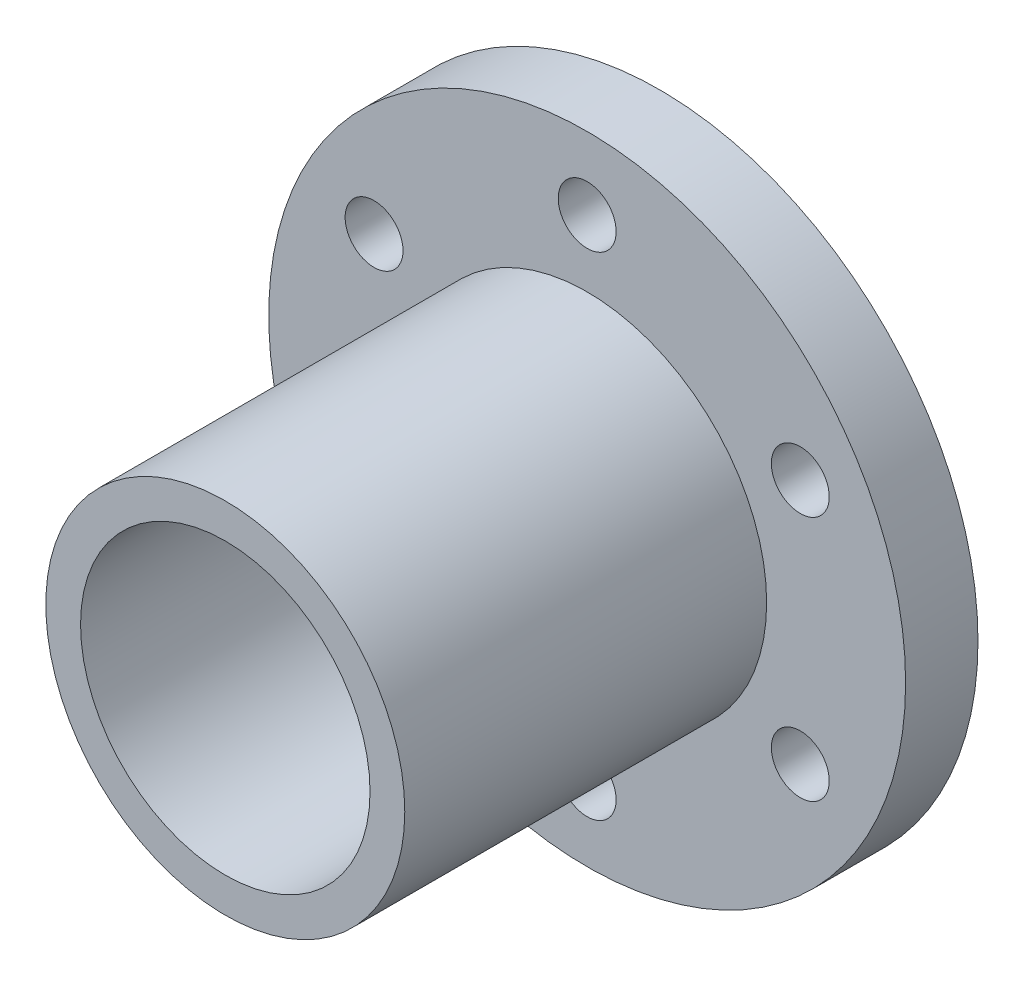
ISO-10303-21;
HEADER;
FILE_DESCRIPTION(('STEP AP214'),'2;1');
FILE_NAME('part.step','',(''),(''),'','','');
FILE_SCHEMA(('AUTOMOTIVE_DESIGN { 1 0 10303 214 1 1 1 1 }'));
ENDSEC;
DATA;
#1=APPLICATION_CONTEXT('core data for automotive mechanical design processes');
#2=APPLICATION_PROTOCOL_DEFINITION('international standard','automotive_design',2000,#1);
#3=PRODUCT_CONTEXT('',#1,'mechanical');
#4=PRODUCT('Part','Part','',(#3));
#5=PRODUCT_RELATED_PRODUCT_CATEGORY('part','',(#4));
#6=PRODUCT_DEFINITION_FORMATION('','',#4);
#7=PRODUCT_DEFINITION_CONTEXT('part definition',#1,'design');
#8=PRODUCT_DEFINITION('design','',#6,#7);
#9=PRODUCT_DEFINITION_SHAPE('','',#8);
#10=(LENGTH_UNIT() NAMED_UNIT(*) SI_UNIT(.MILLI.,.METRE.));
#11=(NAMED_UNIT(*) PLANE_ANGLE_UNIT() SI_UNIT($,.RADIAN.));
#12=(NAMED_UNIT(*) SI_UNIT($,.STERADIAN.) SOLID_ANGLE_UNIT());
#13=UNCERTAINTY_MEASURE_WITH_UNIT(LENGTH_MEASURE(1.E-05),#10,'distance_accuracy_value','');
#14=(GEOMETRIC_REPRESENTATION_CONTEXT(3) GLOBAL_UNCERTAINTY_ASSIGNED_CONTEXT((#13)) GLOBAL_UNIT_ASSIGNED_CONTEXT((#10,
#11,#12)) REPRESENTATION_CONTEXT('',''));
#15=CARTESIAN_POINT('',(0.,0.,0.));
#16=DIRECTION('',(0.,0.,1.));
#17=DIRECTION('',(1.,0.,0.));
#18=AXIS2_PLACEMENT_3D('',#15,#16,#17);
#19=CARTESIAN_POINT('',(0.,0.,25.));
#20=DIRECTION('',(0.,0.,-1.));
#21=DIRECTION('',(-1.,0.,0.));
#22=AXIS2_PLACEMENT_3D('',#19,#20,#21);
#23=CYLINDRICAL_SURFACE('',#22,110.);
#24=CARTESIAN_POINT('',(0.,0.,25.));
#25=DIRECTION('',(0.,0.,1.));
#26=DIRECTION('',(1.,0.,0.));
#27=AXIS2_PLACEMENT_3D('',#24,#25,#26);
#28=CIRCLE('',#27,110.);
#29=CARTESIAN_POINT('',(110.,0.,25.));
#30=VERTEX_POINT('',#29);
#31=EDGE_CURVE('E51',#30,#30,#28,.T.);
#32=ORIENTED_EDGE('',*,*,#31,.F.);
#33=EDGE_LOOP('',(#32));
#34=FACE_BOUND('',#33,.T.);
#35=CARTESIAN_POINT('',(0.,0.,0.));
#36=DIRECTION('',(0.,0.,1.));
#37=DIRECTION('',(1.,0.,0.));
#38=AXIS2_PLACEMENT_3D('',#35,#36,#37);
#39=CIRCLE('',#38,110.);
#40=CARTESIAN_POINT('',(110.,0.,0.));
#41=VERTEX_POINT('',#40);
#42=EDGE_CURVE('E46',#41,#41,#39,.T.);
#43=ORIENTED_EDGE('',*,*,#42,.T.);
#44=EDGE_LOOP('',(#43));
#45=FACE_BOUND('',#44,.T.);
#46=ADVANCED_FACE('F43',(#34,#45),#23,.T.);
#47=CARTESIAN_POINT('',(0.,0.,25.));
#48=DIRECTION('',(0.,0.,1.));
#49=DIRECTION('',(1.,0.,0.));
#50=AXIS2_PLACEMENT_3D('',#47,#48,#49);
#51=PLANE('',#50);
#52=CARTESIAN_POINT('',(0.,85.,25.));
#53=DIRECTION('',(0.,0.,1.));
#54=DIRECTION('',(1.,0.,0.));
#55=AXIS2_PLACEMENT_3D('',#52,#53,#54);
#56=CIRCLE('',#55,9.99999999999999);
#57=CARTESIAN_POINT('',(9.99999999999999,85.,25.));
#58=VERTEX_POINT('',#57);
#59=EDGE_CURVE('E104',#58,#58,#56,.T.);
#60=ORIENTED_EDGE('',*,*,#59,.F.);
#61=EDGE_LOOP('',(#60));
#62=FACE_BOUND('',#61,.T.);
#63=CARTESIAN_POINT('',(-73.6121593216773,42.5,25.));
#64=DIRECTION('',(0.,0.,1.));
#65=DIRECTION('',(1.,0.,0.));
#66=AXIS2_PLACEMENT_3D('',#63,#64,#65);
#67=CIRCLE('',#66,9.99999999999999);
#68=CARTESIAN_POINT('',(-63.6121593216773,42.5,25.));
#69=VERTEX_POINT('',#68);
#70=EDGE_CURVE('E76',#69,#69,#67,.T.);
#71=ORIENTED_EDGE('',*,*,#70,.F.);
#72=EDGE_LOOP('',(#71));
#73=FACE_BOUND('',#72,.T.);
#74=CARTESIAN_POINT('',(-73.6121593216773,-42.5,25.));
#75=DIRECTION('',(0.,0.,1.));
#76=DIRECTION('',(1.,0.,0.));
#77=AXIS2_PLACEMENT_3D('',#74,#75,#76);
#78=CIRCLE('',#77,9.99999999999999);
#79=CARTESIAN_POINT('',(-63.6121593216773,-42.5,25.));
#80=VERTEX_POINT('',#79);
#81=EDGE_CURVE('E75',#80,#80,#78,.T.);
#82=ORIENTED_EDGE('',*,*,#81,.F.);
#83=EDGE_LOOP('',(#82));
#84=FACE_BOUND('',#83,.T.);
#85=CARTESIAN_POINT('',(0.,-85.,25.));
#86=DIRECTION('',(0.,0.,1.));
#87=DIRECTION('',(1.,0.,0.));
#88=AXIS2_PLACEMENT_3D('',#85,#86,#87);
#89=CIRCLE('',#88,9.99999999999999);
#90=CARTESIAN_POINT('',(10.,-85.,25.));
#91=VERTEX_POINT('',#90);
#92=EDGE_CURVE('E84',#91,#91,#89,.T.);
#93=ORIENTED_EDGE('',*,*,#92,.F.);
#94=EDGE_LOOP('',(#93));
#95=FACE_BOUND('',#94,.T.);
#96=CARTESIAN_POINT('',(73.6121593216773,-42.5,25.));
#97=DIRECTION('',(0.,0.,1.));
#98=DIRECTION('',(1.,0.,0.));
#99=AXIS2_PLACEMENT_3D('',#96,#97,#98);
#100=CIRCLE('',#99,10.);
#101=CARTESIAN_POINT('',(83.6121593216773,-42.5,25.));
#102=VERTEX_POINT('',#101);
#103=EDGE_CURVE('E92',#102,#102,#100,.T.);
#104=ORIENTED_EDGE('',*,*,#103,.F.);
#105=EDGE_LOOP('',(#104));
#106=FACE_BOUND('',#105,.T.);
#107=CARTESIAN_POINT('',(73.6121593216773,42.5,25.));
#108=DIRECTION('',(0.,0.,1.));
#109=DIRECTION('',(1.,0.,0.));
#110=AXIS2_PLACEMENT_3D('',#107,#108,#109);
#111=CIRCLE('',#110,9.99999999999999);
#112=CARTESIAN_POINT('',(83.6121593216773,42.5,25.));
#113=VERTEX_POINT('',#112);
#114=EDGE_CURVE('E100',#113,#113,#111,.T.);
#115=ORIENTED_EDGE('',*,*,#114,.F.);
#116=EDGE_LOOP('',(#115));
#117=FACE_BOUND('',#116,.T.);
#118=CARTESIAN_POINT('',(0.,0.,25.));
#119=DIRECTION('',(0.,0.,1.));
#120=DIRECTION('',(1.,0.,0.));
#121=AXIS2_PLACEMENT_3D('',#118,#119,#120);
#122=CIRCLE('',#121,62.);
#123=CARTESIAN_POINT('',(62.,0.,25.));
#124=VERTEX_POINT('',#123);
#125=EDGE_CURVE('E10',#124,#124,#122,.T.);
#126=ORIENTED_EDGE('',*,*,#125,.F.);
#127=EDGE_LOOP('',(#126));
#128=FACE_BOUND('',#127,.T.);
#129=ORIENTED_EDGE('',*,*,#31,.T.);
#130=EDGE_LOOP('',(#129));
#131=FACE_BOUND('',#130,.T.);
#132=ADVANCED_FACE('F129',(#62,#73,#84,#95,#106,#117,#128,#131),#51,.T.);
#133=CARTESIAN_POINT('',(0.,0.,0.));
#134=DIRECTION('',(0.,0.,1.));
#135=DIRECTION('',(1.,0.,0.));
#136=AXIS2_PLACEMENT_3D('',#133,#134,#135);
#137=PLANE('',#136);
#138=CARTESIAN_POINT('',(0.,85.,0.));
#139=DIRECTION('',(0.,0.,1.));
#140=DIRECTION('',(1.,0.,0.));
#141=AXIS2_PLACEMENT_3D('',#138,#139,#140);
#142=CIRCLE('',#141,9.99999999999999);
#143=CARTESIAN_POINT('',(9.99999999999999,85.,0.));
#144=VERTEX_POINT('',#143);
#145=EDGE_CURVE('E67',#144,#144,#142,.T.);
#146=ORIENTED_EDGE('',*,*,#145,.T.);
#147=EDGE_LOOP('',(#146));
#148=FACE_BOUND('',#147,.T.);
#149=CARTESIAN_POINT('',(-73.6121593216773,42.5,0.));
#150=DIRECTION('',(0.,0.,1.));
#151=DIRECTION('',(1.,0.,0.));
#152=AXIS2_PLACEMENT_3D('',#149,#150,#151);
#153=CIRCLE('',#152,9.99999999999999);
#154=CARTESIAN_POINT('',(-63.6121593216773,42.5,0.));
#155=VERTEX_POINT('',#154);
#156=EDGE_CURVE('E105',#155,#155,#153,.T.);
#157=ORIENTED_EDGE('',*,*,#156,.T.);
#158=EDGE_LOOP('',(#157));
#159=FACE_BOUND('',#158,.T.);
#160=CARTESIAN_POINT('',(-73.6121593216773,-42.5,0.));
#161=DIRECTION('',(0.,0.,1.));
#162=DIRECTION('',(1.,0.,0.));
#163=AXIS2_PLACEMENT_3D('',#160,#161,#162);
#164=CIRCLE('',#163,9.99999999999999);
#165=CARTESIAN_POINT('',(-63.6121593216773,-42.5,0.));
#166=VERTEX_POINT('',#165);
#167=EDGE_CURVE('E71',#166,#166,#164,.T.);
#168=ORIENTED_EDGE('',*,*,#167,.T.);
#169=EDGE_LOOP('',(#168));
#170=FACE_BOUND('',#169,.T.);
#171=CARTESIAN_POINT('',(0.,-85.,0.));
#172=DIRECTION('',(0.,0.,1.));
#173=DIRECTION('',(1.,0.,0.));
#174=AXIS2_PLACEMENT_3D('',#171,#172,#173);
#175=CIRCLE('',#174,9.99999999999999);
#176=CARTESIAN_POINT('',(10.,-85.,0.));
#177=VERTEX_POINT('',#176);
#178=EDGE_CURVE('E80',#177,#177,#175,.T.);
#179=ORIENTED_EDGE('',*,*,#178,.T.);
#180=EDGE_LOOP('',(#179));
#181=FACE_BOUND('',#180,.T.);
#182=CARTESIAN_POINT('',(73.6121593216773,-42.5,0.));
#183=DIRECTION('',(0.,0.,1.));
#184=DIRECTION('',(1.,0.,0.));
#185=AXIS2_PLACEMENT_3D('',#182,#183,#184);
#186=CIRCLE('',#185,10.);
#187=CARTESIAN_POINT('',(83.6121593216773,-42.5,0.));
#188=VERTEX_POINT('',#187);
#189=EDGE_CURVE('E88',#188,#188,#186,.T.);
#190=ORIENTED_EDGE('',*,*,#189,.T.);
#191=EDGE_LOOP('',(#190));
#192=FACE_BOUND('',#191,.T.);
#193=CARTESIAN_POINT('',(73.6121593216773,42.5,0.));
#194=DIRECTION('',(0.,0.,1.));
#195=DIRECTION('',(1.,0.,0.));
#196=AXIS2_PLACEMENT_3D('',#193,#194,#195);
#197=CIRCLE('',#196,9.99999999999999);
#198=CARTESIAN_POINT('',(83.6121593216773,42.5,0.));
#199=VERTEX_POINT('',#198);
#200=EDGE_CURVE('E96',#199,#199,#197,.T.);
#201=ORIENTED_EDGE('',*,*,#200,.T.);
#202=EDGE_LOOP('',(#201));
#203=FACE_BOUND('',#202,.T.);
#204=CARTESIAN_POINT('',(0.,0.,0.));
#205=DIRECTION('',(0.,0.,1.));
#206=DIRECTION('',(1.,0.,0.));
#207=AXIS2_PLACEMENT_3D('',#204,#205,#206);
#208=CIRCLE('',#207,50.);
#209=CARTESIAN_POINT('',(50.,0.,0.));
#210=VERTEX_POINT('',#209);
#211=EDGE_CURVE('E62',#210,#210,#208,.T.);
#212=ORIENTED_EDGE('',*,*,#211,.T.);
#213=EDGE_LOOP('',(#212));
#214=FACE_BOUND('',#213,.T.);
#215=ORIENTED_EDGE('',*,*,#42,.F.);
#216=EDGE_LOOP('',(#215));
#217=FACE_BOUND('',#216,.T.);
#218=ADVANCED_FACE('F119',(#148,#159,#170,#181,#192,#203,#214,#217),#137,.F.);
#219=CARTESIAN_POINT('',(0.,0.,150.));
#220=DIRECTION('',(0.,0.,-1.));
#221=DIRECTION('',(-1.,0.,0.));
#222=AXIS2_PLACEMENT_3D('',#219,#220,#221);
#223=CYLINDRICAL_SURFACE('',#222,62.);
#224=CARTESIAN_POINT('',(0.,0.,150.));
#225=DIRECTION('',(0.,0.,1.));
#226=DIRECTION('',(1.,0.,0.));
#227=AXIS2_PLACEMENT_3D('',#224,#225,#226);
#228=CIRCLE('',#227,62.);
#229=CARTESIAN_POINT('',(62.,0.,150.));
#230=VERTEX_POINT('',#229);
#231=EDGE_CURVE('E58',#230,#230,#228,.T.);
#232=ORIENTED_EDGE('',*,*,#231,.F.);
#233=EDGE_LOOP('',(#232));
#234=FACE_BOUND('',#233,.T.);
#235=ORIENTED_EDGE('',*,*,#125,.T.);
#236=EDGE_LOOP('',(#235));
#237=FACE_BOUND('',#236,.T.);
#238=ADVANCED_FACE('F153',(#234,#237),#223,.T.);
#239=CARTESIAN_POINT('',(0.,0.,150.));
#240=DIRECTION('',(0.,0.,1.));
#241=DIRECTION('',(1.,0.,0.));
#242=AXIS2_PLACEMENT_3D('',#239,#240,#241);
#243=PLANE('',#242);
#244=CARTESIAN_POINT('',(0.,0.,150.));
#245=DIRECTION('',(0.,0.,1.));
#246=DIRECTION('',(1.,0.,0.));
#247=AXIS2_PLACEMENT_3D('',#244,#245,#246);
#248=CIRCLE('',#247,50.);
#249=CARTESIAN_POINT('',(50.,0.,150.));
#250=VERTEX_POINT('',#249);
#251=EDGE_CURVE('E63',#250,#250,#248,.T.);
#252=ORIENTED_EDGE('',*,*,#251,.F.);
#253=EDGE_LOOP('',(#252));
#254=FACE_BOUND('',#253,.T.);
#255=ORIENTED_EDGE('',*,*,#231,.T.);
#256=EDGE_LOOP('',(#255));
#257=FACE_BOUND('',#256,.T.);
#258=ADVANCED_FACE('F158',(#254,#257),#243,.T.);
#259=CARTESIAN_POINT('',(0.,0.,0.));
#260=DIRECTION('',(0.,0.,1.));
#261=DIRECTION('',(1.,0.,0.));
#262=AXIS2_PLACEMENT_3D('',#259,#260,#261);
#263=CYLINDRICAL_SURFACE('',#262,50.);
#264=ORIENTED_EDGE('',*,*,#211,.F.);
#265=EDGE_LOOP('',(#264));
#266=FACE_BOUND('',#265,.T.);
#267=ORIENTED_EDGE('',*,*,#251,.T.);
#268=EDGE_LOOP('',(#267));
#269=FACE_BOUND('',#268,.T.);
#270=ADVANCED_FACE('F164',(#266,#269),#263,.F.);
#271=CARTESIAN_POINT('',(73.6121593216773,42.5,0.));
#272=DIRECTION('',(0.,0.,1.));
#273=DIRECTION('',(1.,0.,0.));
#274=AXIS2_PLACEMENT_3D('',#271,#272,#273);
#275=CYLINDRICAL_SURFACE('',#274,9.99999999999999);
#276=ORIENTED_EDGE('',*,*,#200,.F.);
#277=EDGE_LOOP('',(#276));
#278=FACE_BOUND('',#277,.T.);
#279=ORIENTED_EDGE('',*,*,#114,.T.);
#280=EDGE_LOOP('',(#279));
#281=FACE_BOUND('',#280,.T.);
#282=ADVANCED_FACE('F168',(#278,#281),#275,.F.);
#283=CARTESIAN_POINT('',(73.6121593216773,-42.5,0.));
#284=DIRECTION('',(0.,0.,1.));
#285=DIRECTION('',(1.,0.,0.));
#286=AXIS2_PLACEMENT_3D('',#283,#284,#285);
#287=CYLINDRICAL_SURFACE('',#286,10.);
#288=ORIENTED_EDGE('',*,*,#189,.F.);
#289=EDGE_LOOP('',(#288));
#290=FACE_BOUND('',#289,.T.);
#291=ORIENTED_EDGE('',*,*,#103,.T.);
#292=EDGE_LOOP('',(#291));
#293=FACE_BOUND('',#292,.T.);
#294=ADVANCED_FACE('F177',(#290,#293),#287,.F.);
#295=CARTESIAN_POINT('',(0.,-85.,0.));
#296=DIRECTION('',(0.,0.,1.));
#297=DIRECTION('',(1.,0.,0.));
#298=AXIS2_PLACEMENT_3D('',#295,#296,#297);
#299=CYLINDRICAL_SURFACE('',#298,9.99999999999999);
#300=ORIENTED_EDGE('',*,*,#178,.F.);
#301=EDGE_LOOP('',(#300));
#302=FACE_BOUND('',#301,.T.);
#303=ORIENTED_EDGE('',*,*,#92,.T.);
#304=EDGE_LOOP('',(#303));
#305=FACE_BOUND('',#304,.T.);
#306=ADVANCED_FACE('F173',(#302,#305),#299,.F.);
#307=CARTESIAN_POINT('',(-73.6121593216773,-42.5,0.));
#308=DIRECTION('',(0.,0.,1.));
#309=DIRECTION('',(1.,0.,0.));
#310=AXIS2_PLACEMENT_3D('',#307,#308,#309);
#311=CYLINDRICAL_SURFACE('',#310,9.99999999999999);
#312=ORIENTED_EDGE('',*,*,#167,.F.);
#313=EDGE_LOOP('',(#312));
#314=FACE_BOUND('',#313,.T.);
#315=ORIENTED_EDGE('',*,*,#81,.T.);
#316=EDGE_LOOP('',(#315));
#317=FACE_BOUND('',#316,.T.);
#318=ADVANCED_FACE('F170',(#314,#317),#311,.F.);
#319=CARTESIAN_POINT('',(-73.6121593216773,42.5,0.));
#320=DIRECTION('',(0.,0.,1.));
#321=DIRECTION('',(1.,0.,0.));
#322=AXIS2_PLACEMENT_3D('',#319,#320,#321);
#323=CYLINDRICAL_SURFACE('',#322,9.99999999999999);
#324=ORIENTED_EDGE('',*,*,#156,.F.);
#325=EDGE_LOOP('',(#324));
#326=FACE_BOUND('',#325,.T.);
#327=ORIENTED_EDGE('',*,*,#70,.T.);
#328=EDGE_LOOP('',(#327));
#329=FACE_BOUND('',#328,.T.);
#330=ADVANCED_FACE('F125',(#326,#329),#323,.F.);
#331=CARTESIAN_POINT('',(0.,85.,0.));
#332=DIRECTION('',(0.,0.,1.));
#333=DIRECTION('',(1.,0.,0.));
#334=AXIS2_PLACEMENT_3D('',#331,#332,#333);
#335=CYLINDRICAL_SURFACE('',#334,9.99999999999999);
#336=ORIENTED_EDGE('',*,*,#145,.F.);
#337=EDGE_LOOP('',(#336));
#338=FACE_BOUND('',#337,.T.);
#339=ORIENTED_EDGE('',*,*,#59,.T.);
#340=EDGE_LOOP('',(#339));
#341=FACE_BOUND('',#340,.T.);
#342=ADVANCED_FACE('F122',(#338,#341),#335,.F.);
#343=CLOSED_SHELL('',(#46,#132,#218,#238,#258,#270,#282,#294,#306,#318,#330,#342));
#344=MANIFOLD_SOLID_BREP('B2',#343);
#345=ADVANCED_BREP_SHAPE_REPRESENTATION('',(#18,#344),#14);
#346=SHAPE_DEFINITION_REPRESENTATION(#9,#345);
ENDSEC;
END-ISO-10303-21;
